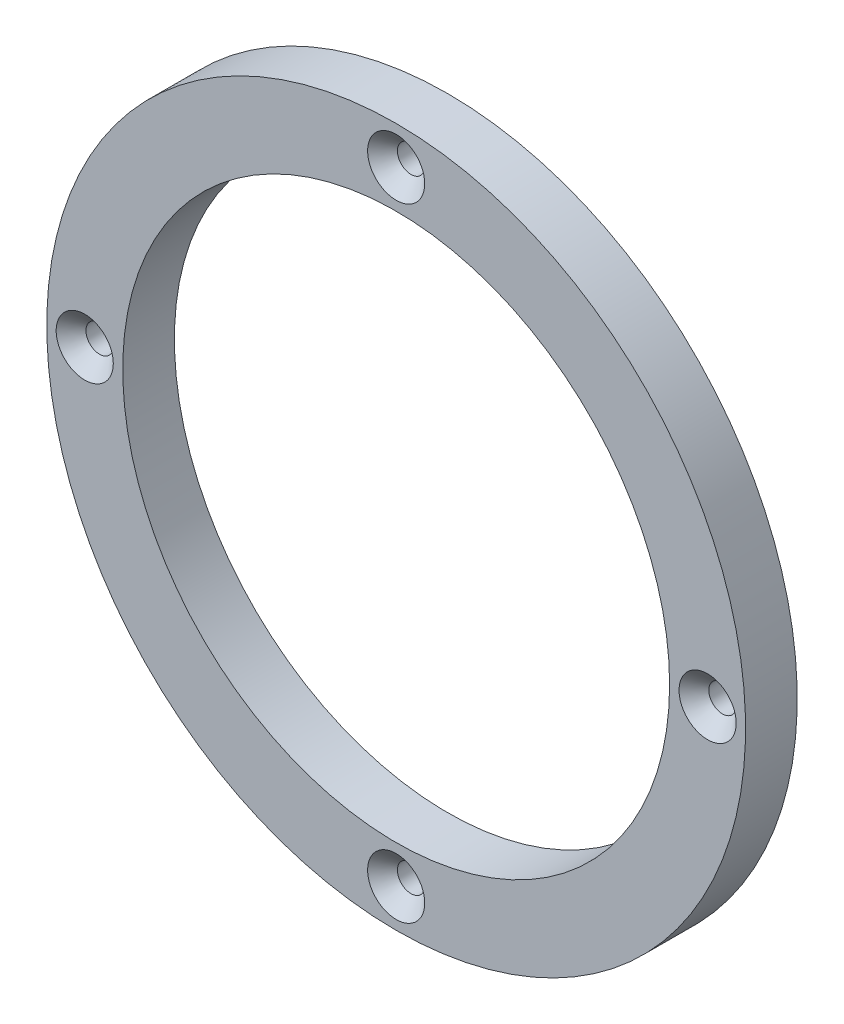
ISO-10303-21;
HEADER;
FILE_DESCRIPTION(('STEP AP214'),'2;1');
FILE_NAME('part.step','',(''),(''),'','','');
FILE_SCHEMA(('AUTOMOTIVE_DESIGN { 1 0 10303 214 1 1 1 1 }'));
ENDSEC;
DATA;
#1=APPLICATION_CONTEXT('core data for automotive mechanical design processes');
#2=APPLICATION_PROTOCOL_DEFINITION('international standard','automotive_design',2000,#1);
#3=PRODUCT_CONTEXT('',#1,'mechanical');
#4=PRODUCT('Part','Part','',(#3));
#5=PRODUCT_RELATED_PRODUCT_CATEGORY('part','',(#4));
#6=PRODUCT_DEFINITION_FORMATION('','',#4);
#7=PRODUCT_DEFINITION_CONTEXT('part definition',#1,'design');
#8=PRODUCT_DEFINITION('design','',#6,#7);
#9=PRODUCT_DEFINITION_SHAPE('','',#8);
#10=(LENGTH_UNIT() NAMED_UNIT(*) SI_UNIT(.MILLI.,.METRE.));
#11=(NAMED_UNIT(*) PLANE_ANGLE_UNIT() SI_UNIT($,.RADIAN.));
#12=(NAMED_UNIT(*) SI_UNIT($,.STERADIAN.) SOLID_ANGLE_UNIT());
#13=UNCERTAINTY_MEASURE_WITH_UNIT(LENGTH_MEASURE(1.E-05),#10,'distance_accuracy_value','');
#14=(GEOMETRIC_REPRESENTATION_CONTEXT(3) GLOBAL_UNCERTAINTY_ASSIGNED_CONTEXT((#13)) GLOBAL_UNIT_ASSIGNED_CONTEXT((#10,
#11,#12)) REPRESENTATION_CONTEXT('',''));
#15=CARTESIAN_POINT('',(0.,0.,0.));
#16=DIRECTION('',(0.,0.,1.));
#17=DIRECTION('',(1.,0.,0.));
#18=AXIS2_PLACEMENT_3D('',#15,#16,#17);
#19=CARTESIAN_POINT('',(0.,0.,8.5));
#20=DIRECTION('',(0.,0.,1.));
#21=DIRECTION('',(1.,0.,0.));
#22=AXIS2_PLACEMENT_3D('',#19,#20,#21);
#23=PLANE('',#22);
#24=CARTESIAN_POINT('',(51.25,0.,8.5));
#25=DIRECTION('',(0.,0.,1.));
#26=DIRECTION('',(1.,0.,0.));
#27=AXIS2_PLACEMENT_3D('',#24,#25,#26);
#28=CIRCLE('',#27,4.7);
#29=CARTESIAN_POINT('',(55.95,0.,8.5));
#30=VERTEX_POINT('',#29);
#31=EDGE_CURVE('E90',#30,#30,#28,.T.);
#32=ORIENTED_EDGE('',*,*,#31,.F.);
#33=EDGE_LOOP('',(#32));
#34=FACE_BOUND('',#33,.T.);
#35=CARTESIAN_POINT('',(-1.78938418615711E-13,-51.25,8.5));
#36=DIRECTION('',(0.,0.,1.));
#37=DIRECTION('',(1.,0.,0.));
#38=AXIS2_PLACEMENT_3D('',#35,#36,#37);
#39=CIRCLE('',#38,4.7);
#40=CARTESIAN_POINT('',(4.69999999999982,-51.25,8.5));
#41=VERTEX_POINT('',#40);
#42=EDGE_CURVE('E81',#41,#41,#39,.T.);
#43=ORIENTED_EDGE('',*,*,#42,.F.);
#44=EDGE_LOOP('',(#43));
#45=FACE_BOUND('',#44,.T.);
#46=CARTESIAN_POINT('',(-51.25,3.57876837231421E-13,8.5));
#47=DIRECTION('',(0.,0.,1.));
#48=DIRECTION('',(1.,0.,0.));
#49=AXIS2_PLACEMENT_3D('',#46,#47,#48);
#50=CIRCLE('',#49,4.7);
#51=CARTESIAN_POINT('',(-46.55,3.57876837231421E-13,8.5));
#52=VERTEX_POINT('',#51);
#53=EDGE_CURVE('E72',#52,#52,#50,.T.);
#54=ORIENTED_EDGE('',*,*,#53,.F.);
#55=EDGE_LOOP('',(#54));
#56=FACE_BOUND('',#55,.T.);
#57=CARTESIAN_POINT('',(5.36815255847132E-13,51.25,8.5));
#58=DIRECTION('',(0.,0.,1.));
#59=DIRECTION('',(1.,0.,0.));
#60=AXIS2_PLACEMENT_3D('',#57,#58,#59);
#61=CIRCLE('',#60,4.7);
#62=CARTESIAN_POINT('',(4.70000000000054,51.25,8.5));
#63=VERTEX_POINT('',#62);
#64=EDGE_CURVE('E63',#63,#63,#61,.T.);
#65=ORIENTED_EDGE('',*,*,#64,.F.);
#66=EDGE_LOOP('',(#65));
#67=FACE_BOUND('',#66,.T.);
#68=CARTESIAN_POINT('',(0.,0.,8.5));
#69=DIRECTION('',(0.,0.,1.));
#70=DIRECTION('',(1.,0.,0.));
#71=AXIS2_PLACEMENT_3D('',#68,#69,#70);
#72=CIRCLE('',#71,45.);
#73=CARTESIAN_POINT('',(45.,0.,8.5));
#74=VERTEX_POINT('',#73);
#75=EDGE_CURVE('E10',#74,#74,#72,.T.);
#76=ORIENTED_EDGE('',*,*,#75,.F.);
#77=EDGE_LOOP('',(#76));
#78=FACE_BOUND('',#77,.T.);
#79=CARTESIAN_POINT('',(0.,0.,8.5));
#80=DIRECTION('',(0.,0.,1.));
#81=DIRECTION('',(0.,1.,0.));
#82=AXIS2_PLACEMENT_3D('',#79,#80,#81);
#83=CIRCLE('',#82,57.5);
#84=CARTESIAN_POINT('',(0.,57.5,8.5));
#85=VERTEX_POINT('',#84);
#86=EDGE_CURVE('E50',#85,#85,#83,.T.);
#87=ORIENTED_EDGE('',*,*,#86,.T.);
#88=EDGE_LOOP('',(#87));
#89=FACE_BOUND('',#88,.T.);
#90=ADVANCED_FACE('F39',(#34,#45,#56,#67,#78,#89),#23,.T.);
#91=CARTESIAN_POINT('',(0.,0.,8.5));
#92=DIRECTION('',(0.,0.,-1.));
#93=DIRECTION('',(-1.,0.,0.));
#94=AXIS2_PLACEMENT_3D('',#91,#92,#93);
#95=CYLINDRICAL_SURFACE('',#94,45.);
#96=ORIENTED_EDGE('',*,*,#75,.T.);
#97=EDGE_LOOP('',(#96));
#98=FACE_BOUND('',#97,.T.);
#99=CARTESIAN_POINT('',(0.,0.,0.));
#100=DIRECTION('',(0.,0.,1.));
#101=DIRECTION('',(1.,0.,0.));
#102=AXIS2_PLACEMENT_3D('',#99,#100,#101);
#103=CIRCLE('',#102,45.);
#104=CARTESIAN_POINT('',(45.,0.,0.));
#105=VERTEX_POINT('',#104);
#106=EDGE_CURVE('E43',#105,#105,#103,.T.);
#107=ORIENTED_EDGE('',*,*,#106,.F.);
#108=EDGE_LOOP('',(#107));
#109=FACE_BOUND('',#108,.T.);
#110=ADVANCED_FACE('F98',(#98,#109),#95,.F.);
#111=CARTESIAN_POINT('',(0.,0.,0.));
#112=DIRECTION('',(0.,0.,1.));
#113=DIRECTION('',(1.,0.,0.));
#114=AXIS2_PLACEMENT_3D('',#111,#112,#113);
#115=PLANE('',#114);
#116=CARTESIAN_POINT('',(51.25,0.,0.));
#117=DIRECTION('',(0.,0.,1.));
#118=DIRECTION('',(1.,0.,0.));
#119=AXIS2_PLACEMENT_3D('',#116,#117,#118);
#120=CIRCLE('',#119,2.25);
#121=CARTESIAN_POINT('',(53.5,0.,0.));
#122=VERTEX_POINT('',#121);
#123=EDGE_CURVE('E84',#122,#122,#120,.T.);
#124=ORIENTED_EDGE('',*,*,#123,.T.);
#125=EDGE_LOOP('',(#124));
#126=FACE_BOUND('',#125,.T.);
#127=CARTESIAN_POINT('',(-1.78938418615711E-13,-51.25,0.));
#128=DIRECTION('',(0.,0.,1.));
#129=DIRECTION('',(1.,0.,0.));
#130=AXIS2_PLACEMENT_3D('',#127,#128,#129);
#131=CIRCLE('',#130,2.25);
#132=CARTESIAN_POINT('',(2.24999999999982,-51.25,0.));
#133=VERTEX_POINT('',#132);
#134=EDGE_CURVE('E75',#133,#133,#131,.T.);
#135=ORIENTED_EDGE('',*,*,#134,.T.);
#136=EDGE_LOOP('',(#135));
#137=FACE_BOUND('',#136,.T.);
#138=CARTESIAN_POINT('',(-51.25,3.57876837231421E-13,0.));
#139=DIRECTION('',(0.,0.,1.));
#140=DIRECTION('',(1.,0.,0.));
#141=AXIS2_PLACEMENT_3D('',#138,#139,#140);
#142=CIRCLE('',#141,2.25);
#143=CARTESIAN_POINT('',(-49.,3.57876837231421E-13,0.));
#144=VERTEX_POINT('',#143);
#145=EDGE_CURVE('E66',#144,#144,#142,.T.);
#146=ORIENTED_EDGE('',*,*,#145,.T.);
#147=EDGE_LOOP('',(#146));
#148=FACE_BOUND('',#147,.T.);
#149=CARTESIAN_POINT('',(5.36815255847132E-13,51.25,0.));
#150=DIRECTION('',(0.,0.,1.));
#151=DIRECTION('',(1.,0.,0.));
#152=AXIS2_PLACEMENT_3D('',#149,#150,#151);
#153=CIRCLE('',#152,2.25);
#154=CARTESIAN_POINT('',(2.25000000000054,51.25,0.));
#155=VERTEX_POINT('',#154);
#156=EDGE_CURVE('E55',#155,#155,#153,.T.);
#157=ORIENTED_EDGE('',*,*,#156,.T.);
#158=EDGE_LOOP('',(#157));
#159=FACE_BOUND('',#158,.T.);
#160=ORIENTED_EDGE('',*,*,#106,.T.);
#161=EDGE_LOOP('',(#160));
#162=FACE_BOUND('',#161,.T.);
#163=CARTESIAN_POINT('',(0.,0.,0.));
#164=DIRECTION('',(0.,0.,1.));
#165=DIRECTION('',(0.,1.,0.));
#166=AXIS2_PLACEMENT_3D('',#163,#164,#165);
#167=CIRCLE('',#166,57.5);
#168=CARTESIAN_POINT('',(0.,57.5,0.));
#169=VERTEX_POINT('',#168);
#170=EDGE_CURVE('E52',#169,#169,#167,.T.);
#171=ORIENTED_EDGE('',*,*,#170,.F.);
#172=EDGE_LOOP('',(#171));
#173=FACE_BOUND('',#172,.T.);
#174=ADVANCED_FACE('F41',(#126,#137,#148,#159,#162,#173),#115,.F.);
#175=CARTESIAN_POINT('',(0.,0.,8.5));
#176=DIRECTION('',(0.,0.,-1.));
#177=DIRECTION('',(-1.,0.,0.));
#178=AXIS2_PLACEMENT_3D('',#175,#176,#177);
#179=CYLINDRICAL_SURFACE('',#178,57.5);
#180=ORIENTED_EDGE('',*,*,#86,.F.);
#181=EDGE_LOOP('',(#180));
#182=FACE_BOUND('',#181,.T.);
#183=ORIENTED_EDGE('',*,*,#170,.T.);
#184=EDGE_LOOP('',(#183));
#185=FACE_BOUND('',#184,.T.);
#186=ADVANCED_FACE('F108',(#182,#185),#179,.T.);
#187=CARTESIAN_POINT('',(5.36815255847132E-13,51.25,8.5));
#188=DIRECTION('',(0.,0.,1.));
#189=DIRECTION('',(1.,0.,0.));
#190=AXIS2_PLACEMENT_3D('',#187,#188,#189);
#191=CYLINDRICAL_SURFACE('',#190,2.25);
#192=ORIENTED_EDGE('',*,*,#156,.F.);
#193=EDGE_LOOP('',(#192));
#194=FACE_BOUND('',#193,.T.);
#195=CARTESIAN_POINT('',(5.36815255847132E-13,51.25,6.05));
#196=DIRECTION('',(0.,0.,1.));
#197=DIRECTION('',(1.,0.,0.));
#198=AXIS2_PLACEMENT_3D('',#195,#196,#197);
#199=CIRCLE('',#198,2.25);
#200=CARTESIAN_POINT('',(2.25000000000054,51.25,6.05));
#201=VERTEX_POINT('',#200);
#202=EDGE_CURVE('E60',#201,#201,#199,.T.);
#203=ORIENTED_EDGE('',*,*,#202,.T.);
#204=EDGE_LOOP('',(#203));
#205=FACE_BOUND('',#204,.T.);
#206=ADVANCED_FACE('F111',(#194,#205),#191,.F.);
#207=CARTESIAN_POINT('',(5.36815255847132E-13,51.25,8.5));
#208=DIRECTION('',(0.,0.,1.));
#209=DIRECTION('',(1.,0.,0.));
#210=AXIS2_PLACEMENT_3D('',#207,#208,#209);
#211=CONICAL_SURFACE('',#210,4.7,0.785398163397449);
#212=ORIENTED_EDGE('',*,*,#202,.F.);
#213=EDGE_LOOP('',(#212));
#214=FACE_BOUND('',#213,.T.);
#215=ORIENTED_EDGE('',*,*,#64,.T.);
#216=EDGE_LOOP('',(#215));
#217=FACE_BOUND('',#216,.T.);
#218=ADVANCED_FACE('F135',(#214,#217),#211,.F.);
#219=CARTESIAN_POINT('',(-51.25,3.57876837231421E-13,8.5));
#220=DIRECTION('',(0.,0.,1.));
#221=DIRECTION('',(1.,0.,0.));
#222=AXIS2_PLACEMENT_3D('',#219,#220,#221);
#223=CYLINDRICAL_SURFACE('',#222,2.25);
#224=ORIENTED_EDGE('',*,*,#145,.F.);
#225=EDGE_LOOP('',(#224));
#226=FACE_BOUND('',#225,.T.);
#227=CARTESIAN_POINT('',(-51.25,3.57876837231421E-13,6.05));
#228=DIRECTION('',(0.,0.,1.));
#229=DIRECTION('',(1.,0.,0.));
#230=AXIS2_PLACEMENT_3D('',#227,#228,#229);
#231=CIRCLE('',#230,2.25);
#232=CARTESIAN_POINT('',(-49.,3.57876837231421E-13,6.05));
#233=VERTEX_POINT('',#232);
#234=EDGE_CURVE('E69',#233,#233,#231,.T.);
#235=ORIENTED_EDGE('',*,*,#234,.T.);
#236=EDGE_LOOP('',(#235));
#237=FACE_BOUND('',#236,.T.);
#238=ADVANCED_FACE('F141',(#226,#237),#223,.F.);
#239=CARTESIAN_POINT('',(-51.25,3.57876837231421E-13,8.5));
#240=DIRECTION('',(0.,0.,1.));
#241=DIRECTION('',(1.,0.,0.));
#242=AXIS2_PLACEMENT_3D('',#239,#240,#241);
#243=CONICAL_SURFACE('',#242,4.7,0.785398163397449);
#244=ORIENTED_EDGE('',*,*,#234,.F.);
#245=EDGE_LOOP('',(#244));
#246=FACE_BOUND('',#245,.T.);
#247=ORIENTED_EDGE('',*,*,#53,.T.);
#248=EDGE_LOOP('',(#247));
#249=FACE_BOUND('',#248,.T.);
#250=ADVANCED_FACE('F147',(#246,#249),#243,.F.);
#251=CARTESIAN_POINT('',(-1.78938418615711E-13,-51.25,8.5));
#252=DIRECTION('',(0.,0.,1.));
#253=DIRECTION('',(1.,0.,0.));
#254=AXIS2_PLACEMENT_3D('',#251,#252,#253);
#255=CYLINDRICAL_SURFACE('',#254,2.25);
#256=ORIENTED_EDGE('',*,*,#134,.F.);
#257=EDGE_LOOP('',(#256));
#258=FACE_BOUND('',#257,.T.);
#259=CARTESIAN_POINT('',(-1.78938418615711E-13,-51.25,6.05));
#260=DIRECTION('',(0.,0.,1.));
#261=DIRECTION('',(1.,0.,0.));
#262=AXIS2_PLACEMENT_3D('',#259,#260,#261);
#263=CIRCLE('',#262,2.25);
#264=CARTESIAN_POINT('',(2.24999999999982,-51.25,6.05));
#265=VERTEX_POINT('',#264);
#266=EDGE_CURVE('E78',#265,#265,#263,.T.);
#267=ORIENTED_EDGE('',*,*,#266,.T.);
#268=EDGE_LOOP('',(#267));
#269=FACE_BOUND('',#268,.T.);
#270=ADVANCED_FACE('F153',(#258,#269),#255,.F.);
#271=CARTESIAN_POINT('',(-1.78938418615711E-13,-51.25,8.5));
#272=DIRECTION('',(0.,0.,1.));
#273=DIRECTION('',(1.,0.,0.));
#274=AXIS2_PLACEMENT_3D('',#271,#272,#273);
#275=CONICAL_SURFACE('',#274,4.7,0.785398163397449);
#276=ORIENTED_EDGE('',*,*,#266,.F.);
#277=EDGE_LOOP('',(#276));
#278=FACE_BOUND('',#277,.T.);
#279=ORIENTED_EDGE('',*,*,#42,.T.);
#280=EDGE_LOOP('',(#279));
#281=FACE_BOUND('',#280,.T.);
#282=ADVANCED_FACE('F157',(#278,#281),#275,.F.);
#283=CARTESIAN_POINT('',(51.25,0.,8.5));
#284=DIRECTION('',(0.,0.,1.));
#285=DIRECTION('',(1.,0.,0.));
#286=AXIS2_PLACEMENT_3D('',#283,#284,#285);
#287=CYLINDRICAL_SURFACE('',#286,2.25);
#288=ORIENTED_EDGE('',*,*,#123,.F.);
#289=EDGE_LOOP('',(#288));
#290=FACE_BOUND('',#289,.T.);
#291=CARTESIAN_POINT('',(51.25,0.,6.05));
#292=DIRECTION('',(0.,0.,1.));
#293=DIRECTION('',(1.,0.,0.));
#294=AXIS2_PLACEMENT_3D('',#291,#292,#293);
#295=CIRCLE('',#294,2.25);
#296=CARTESIAN_POINT('',(53.5,0.,6.05));
#297=VERTEX_POINT('',#296);
#298=EDGE_CURVE('E87',#297,#297,#295,.T.);
#299=ORIENTED_EDGE('',*,*,#298,.T.);
#300=EDGE_LOOP('',(#299));
#301=FACE_BOUND('',#300,.T.);
#302=ADVANCED_FACE('F161',(#290,#301),#287,.F.);
#303=CARTESIAN_POINT('',(51.25,0.,8.5));
#304=DIRECTION('',(0.,0.,1.));
#305=DIRECTION('',(1.,0.,0.));
#306=AXIS2_PLACEMENT_3D('',#303,#304,#305);
#307=CONICAL_SURFACE('',#306,4.7,0.785398163397449);
#308=ORIENTED_EDGE('',*,*,#298,.F.);
#309=EDGE_LOOP('',(#308));
#310=FACE_BOUND('',#309,.T.);
#311=ORIENTED_EDGE('',*,*,#31,.T.);
#312=EDGE_LOOP('',(#311));
#313=FACE_BOUND('',#312,.T.);
#314=ADVANCED_FACE('F94',(#310,#313),#307,.F.);
#315=CLOSED_SHELL('',(#90,#110,#174,#186,#206,#218,#238,#250,#270,#282,#302,#314));
#316=MANIFOLD_SOLID_BREP('B2',#315);
#317=ADVANCED_BREP_SHAPE_REPRESENTATION('',(#18,#316),#14);
#318=SHAPE_DEFINITION_REPRESENTATION(#9,#317);
ENDSEC;
END-ISO-10303-21;
